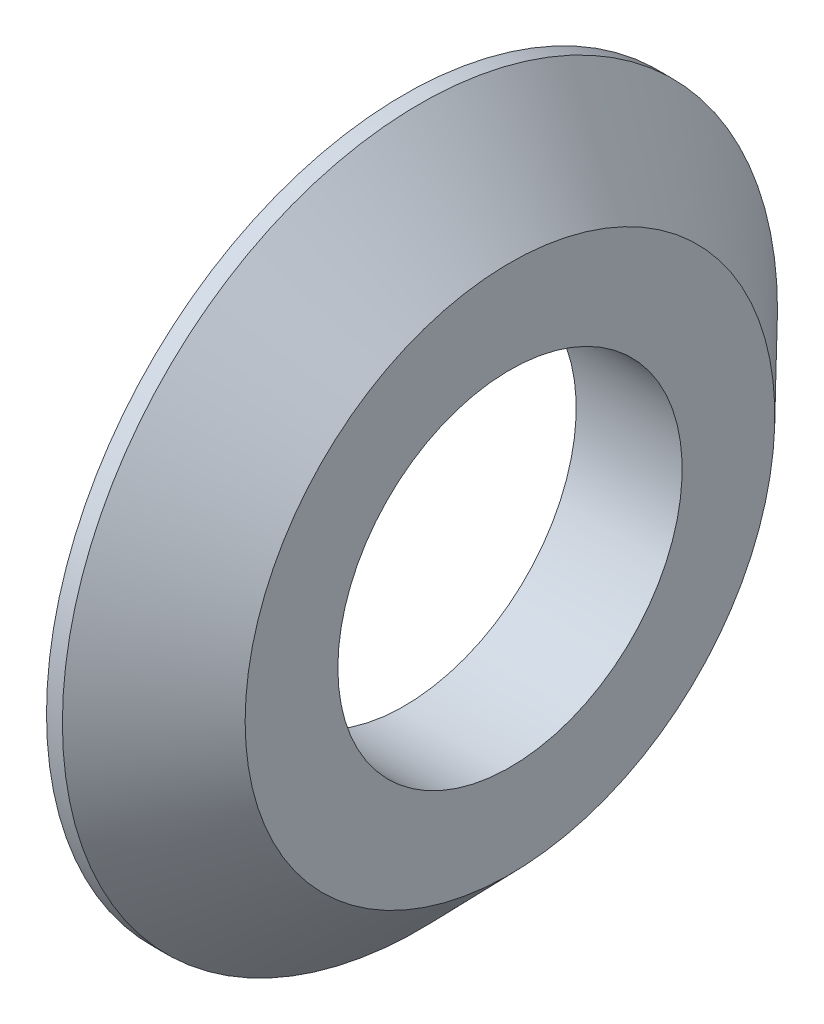
ISO-10303-21;
HEADER;
FILE_DESCRIPTION(('STEP AP214'),'2;1');
FILE_NAME('part.step','',(''),(''),'','','');
FILE_SCHEMA(('AUTOMOTIVE_DESIGN { 1 0 10303 214 1 1 1 1 }'));
ENDSEC;
DATA;
#1=APPLICATION_CONTEXT('core data for automotive mechanical design processes');
#2=APPLICATION_PROTOCOL_DEFINITION('international standard','automotive_design',2000,#1);
#3=PRODUCT_CONTEXT('',#1,'mechanical');
#4=PRODUCT('Part','Part','',(#3));
#5=PRODUCT_RELATED_PRODUCT_CATEGORY('part','',(#4));
#6=PRODUCT_DEFINITION_FORMATION('','',#4);
#7=PRODUCT_DEFINITION_CONTEXT('part definition',#1,'design');
#8=PRODUCT_DEFINITION('design','',#6,#7);
#9=PRODUCT_DEFINITION_SHAPE('','',#8);
#10=(LENGTH_UNIT() NAMED_UNIT(*) SI_UNIT(.MILLI.,.METRE.));
#11=(NAMED_UNIT(*) PLANE_ANGLE_UNIT() SI_UNIT($,.RADIAN.));
#12=(NAMED_UNIT(*) SI_UNIT($,.STERADIAN.) SOLID_ANGLE_UNIT());
#13=UNCERTAINTY_MEASURE_WITH_UNIT(LENGTH_MEASURE(1.E-05),#10,'distance_accuracy_value','');
#14=(GEOMETRIC_REPRESENTATION_CONTEXT(3) GLOBAL_UNCERTAINTY_ASSIGNED_CONTEXT((#13)) GLOBAL_UNIT_ASSIGNED_CONTEXT((#10,
#11,#12)) REPRESENTATION_CONTEXT('',''));
#15=CARTESIAN_POINT('',(0.,0.,0.));
#16=DIRECTION('',(0.,0.,1.));
#17=DIRECTION('',(1.,0.,0.));
#18=AXIS2_PLACEMENT_3D('',#15,#16,#17);
#19=CARTESIAN_POINT('',(-1.,0.,-3.25));
#20=DIRECTION('',(1.,0.,0.));
#21=DIRECTION('',(0.,0.,-1.));
#22=AXIS2_PLACEMENT_3D('',#19,#20,#21);
#23=PLANE('',#22);
#24=CARTESIAN_POINT('',(-1.,0.,0.));
#25=DIRECTION('',(-1.,0.,0.));
#26=DIRECTION('',(0.,0.,1.));
#27=AXIS2_PLACEMENT_3D('',#24,#25,#26);
#28=CIRCLE('',#27,3.25);
#29=CARTESIAN_POINT('',(-1.,0.,3.25));
#30=VERTEX_POINT('',#29);
#31=EDGE_CURVE('E49',#30,#30,#28,.T.);
#32=ORIENTED_EDGE('',*,*,#31,.F.);
#33=EDGE_LOOP('',(#32));
#34=FACE_BOUND('',#33,.T.);
#35=CARTESIAN_POINT('',(-1.,0.,0.));
#36=DIRECTION('',(-1.,0.,0.));
#37=DIRECTION('',(0.,0.,1.));
#38=AXIS2_PLACEMENT_3D('',#35,#36,#37);
#39=CIRCLE('',#38,6.75);
#40=CARTESIAN_POINT('',(-1.,0.,6.75));
#41=VERTEX_POINT('',#40);
#42=EDGE_CURVE('E10',#41,#41,#39,.T.);
#43=ORIENTED_EDGE('',*,*,#42,.T.);
#44=EDGE_LOOP('',(#43));
#45=FACE_BOUND('',#44,.T.);
#46=ADVANCED_FACE('F30',(#34,#45),#23,.F.);
#47=CARTESIAN_POINT('',(-6.25513698630137,0.,0.));
#48=DIRECTION('',(-1.,0.,0.));
#49=DIRECTION('',(0.,0.,1.));
#50=AXIS2_PLACEMENT_3D('',#47,#48,#49);
#51=CYLINDRICAL_SURFACE('',#50,6.75);
#52=ORIENTED_EDGE('',*,*,#42,.F.);
#53=EDGE_LOOP('',(#52));
#54=FACE_BOUND('',#53,.T.);
#55=CARTESIAN_POINT('',(-0.7,0.,0.));
#56=DIRECTION('',(-1.,0.,0.));
#57=DIRECTION('',(0.,0.,1.));
#58=AXIS2_PLACEMENT_3D('',#55,#56,#57);
#59=CIRCLE('',#58,6.75);
#60=CARTESIAN_POINT('',(-0.7,0.,6.75));
#61=VERTEX_POINT('',#60);
#62=EDGE_CURVE('E36',#61,#61,#59,.T.);
#63=ORIENTED_EDGE('',*,*,#62,.T.);
#64=EDGE_LOOP('',(#63));
#65=FACE_BOUND('',#64,.T.);
#66=ADVANCED_FACE('F56',(#54,#65),#51,.T.);
#67=CARTESIAN_POINT('',(1.,0.,0.));
#68=DIRECTION('',(-1.,0.,0.));
#69=DIRECTION('',(0.,0.,1.));
#70=AXIS2_PLACEMENT_3D('',#67,#68,#69);
#71=CONICAL_SURFACE('',#70,5.,0.799889902462948);
#72=ORIENTED_EDGE('',*,*,#62,.F.);
#73=EDGE_LOOP('',(#72));
#74=FACE_BOUND('',#73,.T.);
#75=CARTESIAN_POINT('',(1.,0.,0.));
#76=DIRECTION('',(-1.,0.,0.));
#77=DIRECTION('',(0.,0.,1.));
#78=AXIS2_PLACEMENT_3D('',#75,#76,#77);
#79=CIRCLE('',#78,5.);
#80=CARTESIAN_POINT('',(1.,0.,5.));
#81=VERTEX_POINT('',#80);
#82=EDGE_CURVE('E40',#81,#81,#79,.T.);
#83=ORIENTED_EDGE('',*,*,#82,.T.);
#84=EDGE_LOOP('',(#83));
#85=FACE_BOUND('',#84,.T.);
#86=ADVANCED_FACE('F60',(#74,#85),#71,.T.);
#87=CARTESIAN_POINT('',(1.,0.,-5.));
#88=DIRECTION('',(-1.,0.,0.));
#89=DIRECTION('',(0.,0.,1.));
#90=AXIS2_PLACEMENT_3D('',#87,#88,#89);
#91=PLANE('',#90);
#92=ORIENTED_EDGE('',*,*,#82,.F.);
#93=EDGE_LOOP('',(#92));
#94=FACE_BOUND('',#93,.T.);
#95=CARTESIAN_POINT('',(1.,0.,0.));
#96=DIRECTION('',(-1.,0.,0.));
#97=DIRECTION('',(0.,0.,1.));
#98=AXIS2_PLACEMENT_3D('',#95,#96,#97);
#99=CIRCLE('',#98,3.25);
#100=CARTESIAN_POINT('',(1.,0.,3.25));
#101=VERTEX_POINT('',#100);
#102=EDGE_CURVE('E44',#101,#101,#99,.T.);
#103=ORIENTED_EDGE('',*,*,#102,.T.);
#104=EDGE_LOOP('',(#103));
#105=FACE_BOUND('',#104,.T.);
#106=ADVANCED_FACE('F65',(#94,#105),#91,.F.);
#107=CARTESIAN_POINT('',(-6.25513698630137,0.,0.));
#108=DIRECTION('',(-1.,0.,0.));
#109=DIRECTION('',(0.,0.,1.));
#110=AXIS2_PLACEMENT_3D('',#107,#108,#109);
#111=CYLINDRICAL_SURFACE('',#110,3.25);
#112=ORIENTED_EDGE('',*,*,#102,.F.);
#113=EDGE_LOOP('',(#112));
#114=FACE_BOUND('',#113,.T.);
#115=ORIENTED_EDGE('',*,*,#31,.T.);
#116=EDGE_LOOP('',(#115));
#117=FACE_BOUND('',#116,.T.);
#118=ADVANCED_FACE('F53',(#114,#117),#111,.F.);
#119=CLOSED_SHELL('',(#46,#66,#86,#106,#118));
#120=MANIFOLD_SOLID_BREP('B2',#119);
#121=ADVANCED_BREP_SHAPE_REPRESENTATION('',(#18,#120),#14);
#122=SHAPE_DEFINITION_REPRESENTATION(#9,#121);
ENDSEC;
END-ISO-10303-21;
